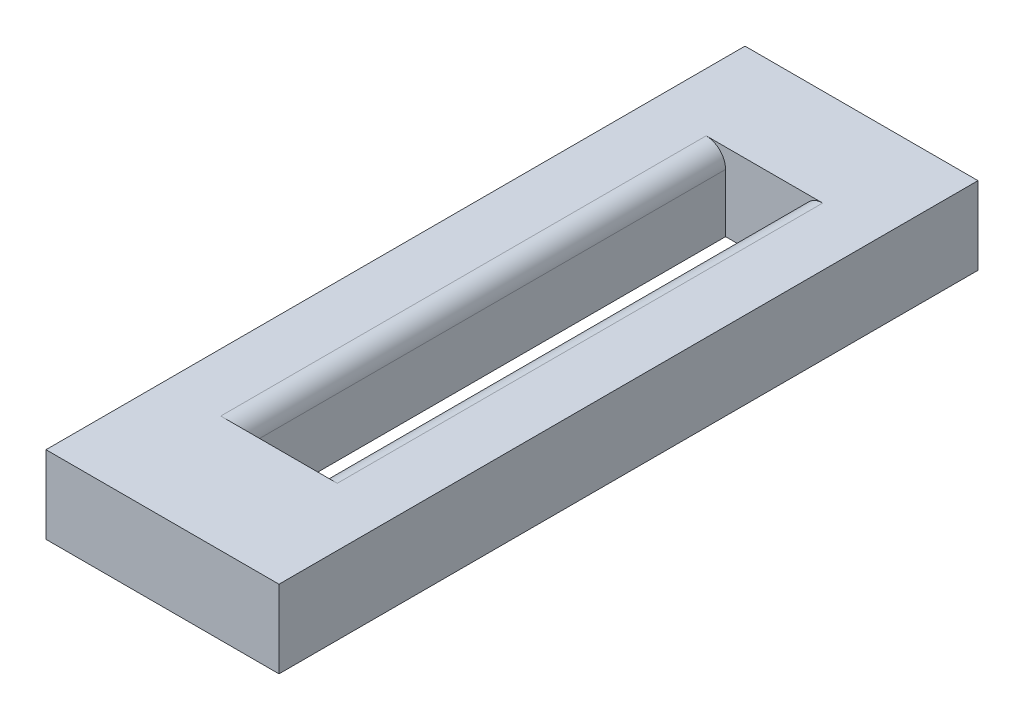
ISO-10303-21;
HEADER;
FILE_DESCRIPTION(('STEP AP214'),'2;1');
FILE_NAME('part.step','',(''),(''),'','','');
FILE_SCHEMA(('AUTOMOTIVE_DESIGN { 1 0 10303 214 1 1 1 1 }'));
ENDSEC;
DATA;
#1=APPLICATION_CONTEXT('core data for automotive mechanical design processes');
#2=APPLICATION_PROTOCOL_DEFINITION('international standard','automotive_design',2000,#1);
#3=PRODUCT_CONTEXT('',#1,'mechanical');
#4=PRODUCT('Part','Part','',(#3));
#5=PRODUCT_RELATED_PRODUCT_CATEGORY('part','',(#4));
#6=PRODUCT_DEFINITION_FORMATION('','',#4);
#7=PRODUCT_DEFINITION_CONTEXT('part definition',#1,'design');
#8=PRODUCT_DEFINITION('design','',#6,#7);
#9=PRODUCT_DEFINITION_SHAPE('','',#8);
#10=(LENGTH_UNIT() NAMED_UNIT(*) SI_UNIT(.MILLI.,.METRE.));
#11=(NAMED_UNIT(*) PLANE_ANGLE_UNIT() SI_UNIT($,.RADIAN.));
#12=(NAMED_UNIT(*) SI_UNIT($,.STERADIAN.) SOLID_ANGLE_UNIT());
#13=UNCERTAINTY_MEASURE_WITH_UNIT(LENGTH_MEASURE(1.E-05),#10,'distance_accuracy_value','');
#14=(GEOMETRIC_REPRESENTATION_CONTEXT(3) GLOBAL_UNCERTAINTY_ASSIGNED_CONTEXT((#13)) GLOBAL_UNIT_ASSIGNED_CONTEXT((#10,
#11,#12)) REPRESENTATION_CONTEXT('',''));
#15=CARTESIAN_POINT('',(0.,0.,0.));
#16=DIRECTION('',(0.,0.,1.));
#17=DIRECTION('',(1.,0.,0.));
#18=AXIS2_PLACEMENT_3D('',#15,#16,#17);
#19=CARTESIAN_POINT('',(30.,10.,-180.));
#20=DIRECTION('',(1.,0.,0.));
#21=DIRECTION('',(0.,0.,-1.));
#22=AXIS2_PLACEMENT_3D('',#19,#20,#21);
#23=PLANE('',#22);
#24=DIRECTION('',(0.,1.,0.));
#25=VECTOR('',#24,1.);
#26=CARTESIAN_POINT('',(30.,10.,0.));
#27=LINE('',#26,#25);
#28=CARTESIAN_POINT('',(30.,-10.,0.));
#29=VERTEX_POINT('',#28);
#30=CARTESIAN_POINT('',(30.,10.,0.));
#31=VERTEX_POINT('',#30);
#32=EDGE_CURVE('E145',#29,#31,#27,.T.);
#33=ORIENTED_EDGE('',*,*,#32,.F.);
#34=DIRECTION('',(0.,0.,1.));
#35=VECTOR('',#34,1.);
#36=CARTESIAN_POINT('',(30.,-10.,-180.));
#37=LINE('',#36,#35);
#38=CARTESIAN_POINT('',(30.,-10.,-180.));
#39=VERTEX_POINT('',#38);
#40=EDGE_CURVE('E174',#39,#29,#37,.T.);
#41=ORIENTED_EDGE('',*,*,#40,.F.);
#42=DIRECTION('',(0.,1.,0.));
#43=VECTOR('',#42,1.);
#44=CARTESIAN_POINT('',(30.,10.,-180.));
#45=LINE('',#44,#43);
#46=CARTESIAN_POINT('',(30.,10.,-180.));
#47=VERTEX_POINT('',#46);
#48=EDGE_CURVE('E150',#39,#47,#45,.T.);
#49=ORIENTED_EDGE('',*,*,#48,.T.);
#50=DIRECTION('',(0.,0.,1.));
#51=VECTOR('',#50,1.);
#52=CARTESIAN_POINT('',(30.,10.,-180.));
#53=LINE('',#52,#51);
#54=EDGE_CURVE('E163',#47,#31,#53,.T.);
#55=ORIENTED_EDGE('',*,*,#54,.T.);
#56=EDGE_LOOP('',(#33,#41,#49,#55));
#57=FACE_BOUND('',#56,.T.);
#58=ADVANCED_FACE('F36',(#57),#23,.T.);
#59=CARTESIAN_POINT('',(-30.,-10.,-180.));
#60=DIRECTION('',(0.,-1.,0.));
#61=DIRECTION('',(0.,0.,-1.));
#62=AXIS2_PLACEMENT_3D('',#59,#60,#61);
#63=PLANE('',#62);
#64=DIRECTION('',(0.,0.,-1.));
#65=VECTOR('',#64,1.);
#66=CARTESIAN_POINT('',(9.99999999999996,-10.,-155.));
#67=LINE('',#66,#65);
#68=CARTESIAN_POINT('',(9.99999999999999,-10.,-30.));
#69=VERTEX_POINT('',#68);
#70=CARTESIAN_POINT('',(9.99999999999996,-10.,-155.));
#71=VERTEX_POINT('',#70);
#72=EDGE_CURVE('E116',#69,#71,#67,.T.);
#73=ORIENTED_EDGE('',*,*,#72,.T.);
#74=DIRECTION('',(-1.,0.,0.));
#75=VECTOR('',#74,1.);
#76=CARTESIAN_POINT('',(-10.,-10.,-155.));
#77=LINE('',#76,#75);
#78=CARTESIAN_POINT('',(-10.,-10.,-155.));
#79=VERTEX_POINT('',#78);
#80=EDGE_CURVE('E125',#71,#79,#77,.T.);
#81=ORIENTED_EDGE('',*,*,#80,.T.);
#82=DIRECTION('',(0.,0.,1.));
#83=VECTOR('',#82,1.);
#84=CARTESIAN_POINT('',(-10.,-10.,-155.));
#85=LINE('',#84,#83);
#86=CARTESIAN_POINT('',(-10.,-10.,-30.));
#87=VERTEX_POINT('',#86);
#88=EDGE_CURVE('E130',#79,#87,#85,.T.);
#89=ORIENTED_EDGE('',*,*,#88,.T.);
#90=DIRECTION('',(1.,0.,0.));
#91=VECTOR('',#90,1.);
#92=CARTESIAN_POINT('',(-10.,-10.,-30.));
#93=LINE('',#92,#91);
#94=EDGE_CURVE('E121',#87,#69,#93,.T.);
#95=ORIENTED_EDGE('',*,*,#94,.T.);
#96=EDGE_LOOP('',(#73,#81,#89,#95));
#97=FACE_BOUND('',#96,.T.);
#98=DIRECTION('',(1.,0.,0.));
#99=VECTOR('',#98,1.);
#100=CARTESIAN_POINT('',(-30.,-10.,0.));
#101=LINE('',#100,#99);
#102=CARTESIAN_POINT('',(-30.,-10.,0.));
#103=VERTEX_POINT('',#102);
#104=EDGE_CURVE('E154',#103,#29,#101,.T.);
#105=ORIENTED_EDGE('',*,*,#104,.F.);
#106=DIRECTION('',(0.,0.,1.));
#107=VECTOR('',#106,1.);
#108=CARTESIAN_POINT('',(-30.,-10.,-180.));
#109=LINE('',#108,#107);
#110=CARTESIAN_POINT('',(-30.,-10.,-180.));
#111=VERTEX_POINT('',#110);
#112=EDGE_CURVE('E177',#111,#103,#109,.T.);
#113=ORIENTED_EDGE('',*,*,#112,.F.);
#114=DIRECTION('',(1.,0.,0.));
#115=VECTOR('',#114,1.);
#116=CARTESIAN_POINT('',(-30.,-10.,-180.));
#117=LINE('',#116,#115);
#118=EDGE_CURVE('E160',#111,#39,#117,.T.);
#119=ORIENTED_EDGE('',*,*,#118,.T.);
#120=ORIENTED_EDGE('',*,*,#40,.T.);
#121=EDGE_LOOP('',(#105,#113,#119,#120));
#122=FACE_BOUND('',#121,.T.);
#123=ADVANCED_FACE('F132',(#97,#122),#63,.T.);
#124=CARTESIAN_POINT('',(-30.,10.,-180.));
#125=DIRECTION('',(-1.,0.,0.));
#126=DIRECTION('',(0.,0.,1.));
#127=AXIS2_PLACEMENT_3D('',#124,#125,#126);
#128=PLANE('',#127);
#129=DIRECTION('',(0.,-1.,0.));
#130=VECTOR('',#129,1.);
#131=CARTESIAN_POINT('',(-30.,10.,0.));
#132=LINE('',#131,#130);
#133=CARTESIAN_POINT('',(-30.,10.,0.));
#134=VERTEX_POINT('',#133);
#135=EDGE_CURVE('E169',#134,#103,#132,.T.);
#136=ORIENTED_EDGE('',*,*,#135,.F.);
#137=DIRECTION('',(0.,0.,1.));
#138=VECTOR('',#137,1.);
#139=CARTESIAN_POINT('',(-30.,10.,-180.));
#140=LINE('',#139,#138);
#141=CARTESIAN_POINT('',(-30.,10.,-180.));
#142=VERTEX_POINT('',#141);
#143=EDGE_CURVE('E179',#142,#134,#140,.T.);
#144=ORIENTED_EDGE('',*,*,#143,.F.);
#145=DIRECTION('',(0.,-1.,0.));
#146=VECTOR('',#145,1.);
#147=CARTESIAN_POINT('',(-30.,10.,-180.));
#148=LINE('',#147,#146);
#149=EDGE_CURVE('E157',#142,#111,#148,.T.);
#150=ORIENTED_EDGE('',*,*,#149,.T.);
#151=ORIENTED_EDGE('',*,*,#112,.T.);
#152=EDGE_LOOP('',(#136,#144,#150,#151));
#153=FACE_BOUND('',#152,.T.);
#154=ADVANCED_FACE('F221',(#153),#128,.T.);
#155=CARTESIAN_POINT('',(-30.,10.,-180.));
#156=DIRECTION('',(0.,1.,0.));
#157=DIRECTION('',(0.,0.,1.));
#158=AXIS2_PLACEMENT_3D('',#155,#156,#157);
#159=PLANE('',#158);
#160=DIRECTION('',(1.,0.,0.));
#161=VECTOR('',#160,1.);
#162=CARTESIAN_POINT('',(-10.,10.,-30.));
#163=LINE('',#162,#161);
#164=CARTESIAN_POINT('',(-15.,10.,-30.));
#165=VERTEX_POINT('',#164);
#166=CARTESIAN_POINT('',(15.,10.,-30.));
#167=VERTEX_POINT('',#166);
#168=EDGE_CURVE('E135',#165,#167,#163,.T.);
#169=ORIENTED_EDGE('',*,*,#168,.F.);
#170=DIRECTION('',(0.,0.,1.));
#171=VECTOR('',#170,1.);
#172=CARTESIAN_POINT('',(-15.,10.,-155.));
#173=LINE('',#172,#171);
#174=CARTESIAN_POINT('',(-15.,10.,-155.));
#175=VERTEX_POINT('',#174);
#176=EDGE_CURVE('E187',#165,#175,#173,.F.);
#177=ORIENTED_EDGE('',*,*,#176,.T.);
#178=DIRECTION('',(-1.,0.,0.));
#179=VECTOR('',#178,1.);
#180=CARTESIAN_POINT('',(-10.,10.,-155.));
#181=LINE('',#180,#179);
#182=CARTESIAN_POINT('',(15.,10.,-155.));
#183=VERTEX_POINT('',#182);
#184=EDGE_CURVE('E137',#183,#175,#181,.T.);
#185=ORIENTED_EDGE('',*,*,#184,.F.);
#186=DIRECTION('',(0.,0.,-1.));
#187=VECTOR('',#186,1.);
#188=CARTESIAN_POINT('',(15.,10.,-30.));
#189=LINE('',#188,#187);
#190=EDGE_CURVE('E184',#183,#167,#189,.F.);
#191=ORIENTED_EDGE('',*,*,#190,.T.);
#192=EDGE_LOOP('',(#169,#177,#185,#191));
#193=FACE_BOUND('',#192,.T.);
#194=DIRECTION('',(-1.,0.,0.));
#195=VECTOR('',#194,1.);
#196=CARTESIAN_POINT('',(-30.,10.,0.));
#197=LINE('',#196,#195);
#198=EDGE_CURVE('E166',#31,#134,#197,.T.);
#199=ORIENTED_EDGE('',*,*,#198,.F.);
#200=ORIENTED_EDGE('',*,*,#54,.F.);
#201=DIRECTION('',(-1.,0.,0.));
#202=VECTOR('',#201,1.);
#203=CARTESIAN_POINT('',(-30.,10.,-180.));
#204=LINE('',#203,#202);
#205=EDGE_CURVE('E153',#47,#142,#204,.T.);
#206=ORIENTED_EDGE('',*,*,#205,.T.);
#207=ORIENTED_EDGE('',*,*,#143,.T.);
#208=EDGE_LOOP('',(#199,#200,#206,#207));
#209=FACE_BOUND('',#208,.T.);
#210=ADVANCED_FACE('F196',(#193,#209),#159,.T.);
#211=CARTESIAN_POINT('',(0.,0.,-180.));
#212=DIRECTION('',(0.,0.,1.));
#213=DIRECTION('',(1.,0.,0.));
#214=AXIS2_PLACEMENT_3D('',#211,#212,#213);
#215=PLANE('',#214);
#216=ORIENTED_EDGE('',*,*,#48,.F.);
#217=ORIENTED_EDGE('',*,*,#118,.F.);
#218=ORIENTED_EDGE('',*,*,#149,.F.);
#219=ORIENTED_EDGE('',*,*,#205,.F.);
#220=EDGE_LOOP('',(#216,#217,#218,#219));
#221=FACE_BOUND('',#220,.T.);
#222=ADVANCED_FACE('F235',(#221),#215,.F.);
#223=CARTESIAN_POINT('',(0.,0.,0.));
#224=DIRECTION('',(0.,0.,1.));
#225=DIRECTION('',(1.,0.,0.));
#226=AXIS2_PLACEMENT_3D('',#223,#224,#225);
#227=PLANE('',#226);
#228=ORIENTED_EDGE('',*,*,#32,.T.);
#229=ORIENTED_EDGE('',*,*,#198,.T.);
#230=ORIENTED_EDGE('',*,*,#135,.T.);
#231=ORIENTED_EDGE('',*,*,#104,.T.);
#232=EDGE_LOOP('',(#228,#229,#230,#231));
#233=FACE_BOUND('',#232,.T.);
#234=ADVANCED_FACE('F213',(#233),#227,.T.);
#235=CARTESIAN_POINT('',(9.99999999999996,-10.,-155.));
#236=DIRECTION('',(1.,0.,0.));
#237=DIRECTION('',(0.,0.,-1.));
#238=AXIS2_PLACEMENT_3D('',#235,#236,#237);
#239=PLANE('',#238);
#240=DIRECTION('',(0.,1.,0.));
#241=VECTOR('',#240,1.);
#242=CARTESIAN_POINT('',(9.99999999999999,-10.,-30.));
#243=LINE('',#242,#241);
#244=CARTESIAN_POINT('',(9.99999999999999,5.,-30.));
#245=VERTEX_POINT('',#244);
#246=EDGE_CURVE('E143',#69,#245,#243,.T.);
#247=ORIENTED_EDGE('',*,*,#246,.T.);
#248=DIRECTION('',(0.,0.,-1.));
#249=VECTOR('',#248,1.);
#250=CARTESIAN_POINT('',(9.99999999999996,5.,-155.));
#251=LINE('',#250,#249);
#252=CARTESIAN_POINT('',(9.99999999999996,5.,-155.));
#253=VERTEX_POINT('',#252);
#254=EDGE_CURVE('E118',#245,#253,#251,.T.);
#255=ORIENTED_EDGE('',*,*,#254,.T.);
#256=DIRECTION('',(0.,1.,0.));
#257=VECTOR('',#256,1.);
#258=CARTESIAN_POINT('',(9.99999999999996,-10.,-155.));
#259=LINE('',#258,#257);
#260=EDGE_CURVE('E112',#71,#253,#259,.T.);
#261=ORIENTED_EDGE('',*,*,#260,.F.);
#262=ORIENTED_EDGE('',*,*,#72,.F.);
#263=EDGE_LOOP('',(#247,#255,#261,#262));
#264=FACE_BOUND('',#263,.T.);
#265=ADVANCED_FACE('F114',(#264),#239,.F.);
#266=CARTESIAN_POINT('',(-10.,-10.,-30.));
#267=DIRECTION('',(0.,0.,1.));
#268=DIRECTION('',(1.,0.,0.));
#269=AXIS2_PLACEMENT_3D('',#266,#267,#268);
#270=PLANE('',#269);
#271=ORIENTED_EDGE('',*,*,#168,.T.);
#272=CARTESIAN_POINT('',(15.,5.,-30.));
#273=DIRECTION('',(0.,0.,1.));
#274=DIRECTION('',(1.,0.,0.));
#275=AXIS2_PLACEMENT_3D('',#272,#273,#274);
#276=CIRCLE('',#275,5.);
#277=EDGE_CURVE('E11',#167,#245,#276,.T.);
#278=ORIENTED_EDGE('',*,*,#277,.T.);
#279=ORIENTED_EDGE('',*,*,#246,.F.);
#280=ORIENTED_EDGE('',*,*,#94,.F.);
#281=DIRECTION('',(0.,1.,0.));
#282=VECTOR('',#281,1.);
#283=CARTESIAN_POINT('',(-10.,-10.,-30.));
#284=LINE('',#283,#282);
#285=CARTESIAN_POINT('',(-10.,5.,-30.));
#286=VERTEX_POINT('',#285);
#287=EDGE_CURVE('E146',#87,#286,#284,.T.);
#288=ORIENTED_EDGE('',*,*,#287,.T.);
#289=CARTESIAN_POINT('',(-15.,5.,-30.));
#290=DIRECTION('',(0.,0.,1.));
#291=DIRECTION('',(1.,0.,0.));
#292=AXIS2_PLACEMENT_3D('',#289,#290,#291);
#293=CIRCLE('',#292,5.);
#294=EDGE_CURVE('E191',#286,#165,#293,.T.);
#295=ORIENTED_EDGE('',*,*,#294,.T.);
#296=EDGE_LOOP('',(#271,#278,#279,#280,#288,#295));
#297=FACE_BOUND('',#296,.T.);
#298=ADVANCED_FACE('F205',(#297),#270,.F.);
#299=CARTESIAN_POINT('',(-10.,-10.,-155.));
#300=DIRECTION('',(-1.,0.,0.));
#301=DIRECTION('',(0.,0.,1.));
#302=AXIS2_PLACEMENT_3D('',#299,#300,#301);
#303=PLANE('',#302);
#304=DIRECTION('',(0.,1.,0.));
#305=VECTOR('',#304,1.);
#306=CARTESIAN_POINT('',(-10.,-10.,-155.));
#307=LINE('',#306,#305);
#308=CARTESIAN_POINT('',(-10.,5.,-155.));
#309=VERTEX_POINT('',#308);
#310=EDGE_CURVE('E120',#79,#309,#307,.T.);
#311=ORIENTED_EDGE('',*,*,#310,.T.);
#312=DIRECTION('',(0.,0.,1.));
#313=VECTOR('',#312,1.);
#314=CARTESIAN_POINT('',(-10.,5.,-30.));
#315=LINE('',#314,#313);
#316=EDGE_CURVE('E176',#309,#286,#315,.T.);
#317=ORIENTED_EDGE('',*,*,#316,.T.);
#318=ORIENTED_EDGE('',*,*,#287,.F.);
#319=ORIENTED_EDGE('',*,*,#88,.F.);
#320=EDGE_LOOP('',(#311,#317,#318,#319));
#321=FACE_BOUND('',#320,.T.);
#322=ADVANCED_FACE('F204',(#321),#303,.F.);
#323=CARTESIAN_POINT('',(-10.,-10.,-155.));
#324=DIRECTION('',(0.,0.,-1.));
#325=DIRECTION('',(-1.,0.,0.));
#326=AXIS2_PLACEMENT_3D('',#323,#324,#325);
#327=PLANE('',#326);
#328=ORIENTED_EDGE('',*,*,#184,.T.);
#329=CARTESIAN_POINT('',(-15.,5.,-155.));
#330=DIRECTION('',(0.,0.,-1.));
#331=DIRECTION('',(-1.,0.,0.));
#332=AXIS2_PLACEMENT_3D('',#329,#330,#331);
#333=CIRCLE('',#332,5.);
#334=EDGE_CURVE('E194',#175,#309,#333,.T.);
#335=ORIENTED_EDGE('',*,*,#334,.T.);
#336=ORIENTED_EDGE('',*,*,#310,.F.);
#337=ORIENTED_EDGE('',*,*,#80,.F.);
#338=ORIENTED_EDGE('',*,*,#260,.T.);
#339=CARTESIAN_POINT('',(15.,5.,-155.));
#340=DIRECTION('',(0.,0.,-1.));
#341=DIRECTION('',(-1.,0.,0.));
#342=AXIS2_PLACEMENT_3D('',#339,#340,#341);
#343=CIRCLE('',#342,5.);
#344=EDGE_CURVE('E44',#253,#183,#343,.T.);
#345=ORIENTED_EDGE('',*,*,#344,.T.);
#346=EDGE_LOOP('',(#328,#335,#336,#337,#338,#345));
#347=FACE_BOUND('',#346,.T.);
#348=ADVANCED_FACE('F126',(#347),#327,.F.);
#349=CARTESIAN_POINT('',(-15.,5.,-155.));
#350=DIRECTION('',(0.,0.,-1.));
#351=DIRECTION('',(-1.,0.,0.));
#352=AXIS2_PLACEMENT_3D('',#349,#350,#351);
#353=CYLINDRICAL_SURFACE('',#352,5.);
#354=ORIENTED_EDGE('',*,*,#334,.F.);
#355=ORIENTED_EDGE('',*,*,#176,.F.);
#356=ORIENTED_EDGE('',*,*,#294,.F.);
#357=ORIENTED_EDGE('',*,*,#316,.F.);
#358=EDGE_LOOP('',(#354,#355,#356,#357));
#359=FACE_BOUND('',#358,.T.);
#360=ADVANCED_FACE('F202',(#359),#353,.T.);
#361=CARTESIAN_POINT('',(15.,5.,-155.));
#362=DIRECTION('',(0.,0.,1.));
#363=DIRECTION('',(1.,0.,0.));
#364=AXIS2_PLACEMENT_3D('',#361,#362,#363);
#365=CYLINDRICAL_SURFACE('',#364,5.);
#366=ORIENTED_EDGE('',*,*,#277,.F.);
#367=ORIENTED_EDGE('',*,*,#190,.F.);
#368=ORIENTED_EDGE('',*,*,#344,.F.);
#369=ORIENTED_EDGE('',*,*,#254,.F.);
#370=EDGE_LOOP('',(#366,#367,#368,#369));
#371=FACE_BOUND('',#370,.T.);
#372=ADVANCED_FACE('F38',(#371),#365,.T.);
#373=CLOSED_SHELL('',(#58,#123,#154,#210,#222,#234,#265,#298,#322,#348,#360,#372));
#374=MANIFOLD_SOLID_BREP('B2',#373);
#375=ADVANCED_BREP_SHAPE_REPRESENTATION('',(#18,#374),#14);
#376=SHAPE_DEFINITION_REPRESENTATION(#9,#375);
ENDSEC;
END-ISO-10303-21;
